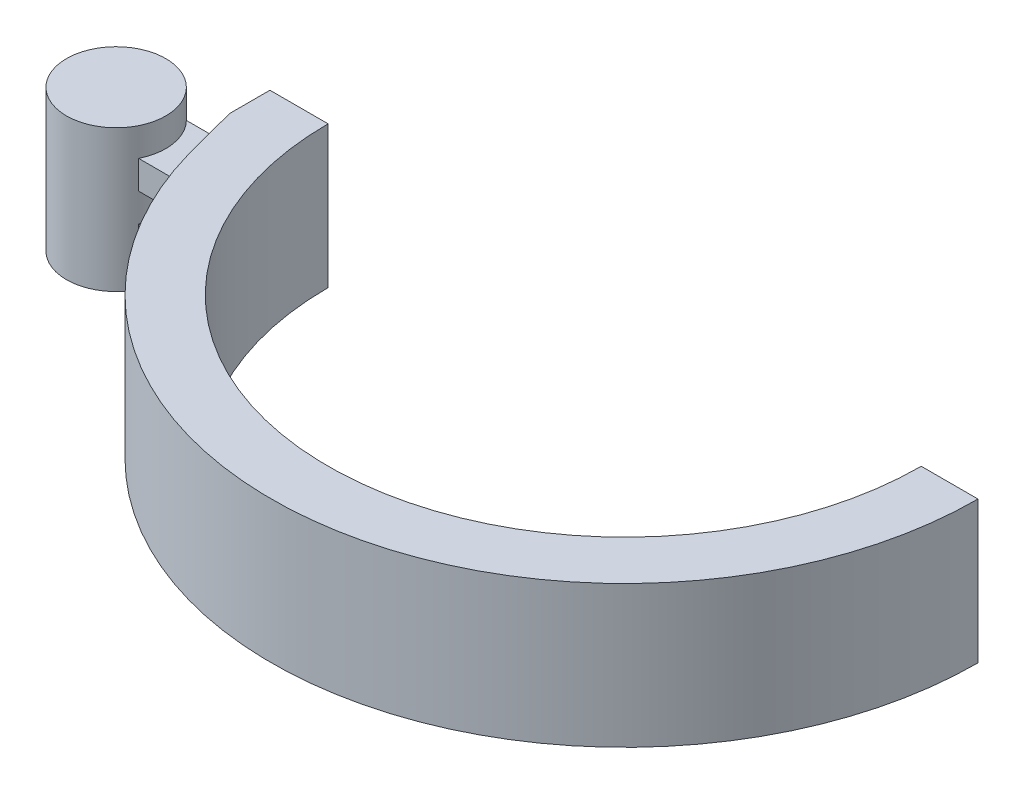
ISO-10303-21;
HEADER;
FILE_DESCRIPTION(('STEP AP214'),'2;1');
FILE_NAME('part.step','',(''),(''),'','','');
FILE_SCHEMA(('AUTOMOTIVE_DESIGN { 1 0 10303 214 1 1 1 1 }'));
ENDSEC;
DATA;
#1=APPLICATION_CONTEXT('core data for automotive mechanical design processes');
#2=APPLICATION_PROTOCOL_DEFINITION('international standard','automotive_design',2000,#1);
#3=PRODUCT_CONTEXT('',#1,'mechanical');
#4=PRODUCT('Part','Part','',(#3));
#5=PRODUCT_RELATED_PRODUCT_CATEGORY('part','',(#4));
#6=PRODUCT_DEFINITION_FORMATION('','',#4);
#7=PRODUCT_DEFINITION_CONTEXT('part definition',#1,'design');
#8=PRODUCT_DEFINITION('design','',#6,#7);
#9=PRODUCT_DEFINITION_SHAPE('','',#8);
#10=(LENGTH_UNIT() NAMED_UNIT(*) SI_UNIT(.MILLI.,.METRE.));
#11=(NAMED_UNIT(*) PLANE_ANGLE_UNIT() SI_UNIT($,.RADIAN.));
#12=(NAMED_UNIT(*) SI_UNIT($,.STERADIAN.) SOLID_ANGLE_UNIT());
#13=UNCERTAINTY_MEASURE_WITH_UNIT(LENGTH_MEASURE(1.E-05),#10,'distance_accuracy_value','');
#14=(GEOMETRIC_REPRESENTATION_CONTEXT(3) GLOBAL_UNCERTAINTY_ASSIGNED_CONTEXT((#13)) GLOBAL_UNIT_ASSIGNED_CONTEXT((#10,
#11,#12)) REPRESENTATION_CONTEXT('',''));
#15=CARTESIAN_POINT('',(0.,0.,0.));
#16=DIRECTION('',(0.,0.,1.));
#17=DIRECTION('',(1.,0.,0.));
#18=AXIS2_PLACEMENT_3D('',#15,#16,#17);
#19=CARTESIAN_POINT('',(0.,0.,0.));
#20=DIRECTION('',(0.,1.,0.));
#21=DIRECTION('',(0.,0.,1.));
#22=AXIS2_PLACEMENT_3D('',#19,#20,#21);
#23=PLANE('',#22);
#24=CARTESIAN_POINT('',(15.3000000000166,0.,-2.61808950739844));
#25=DIRECTION('',(0.,1.,0.));
#26=DIRECTION('',(0.,0.,1.));
#27=AXIS2_PLACEMENT_3D('',#24,#25,#26);
#28=CIRCLE('',#27,12.45);
#29=CARTESIAN_POINT('',(3.3213643439342,0.,0.77525512862535));
#30=VERTEX_POINT('',#29);
#31=CARTESIAN_POINT('',(27.7500000000166,0.,-2.61808950739844));
#32=VERTEX_POINT('',#31);
#33=EDGE_CURVE('E173',#30,#32,#28,.T.);
#34=ORIENTED_EDGE('',*,*,#33,.F.);
#35=CARTESIAN_POINT('',(50.5741495389799,0.,-12.610658741899));
#36=DIRECTION('',(0.,-1.,0.));
#37=DIRECTION('',(0.,0.,1.));
#38=AXIS2_PLACEMENT_3D('',#35,#36,#37);
#39=CIRCLE('',#38,49.1122021379436);
#40=CARTESIAN_POINT('',(2.8000000000166,0.,-1.22474487137465));
#41=VERTEX_POINT('',#40);
#42=EDGE_CURVE('E154',#30,#41,#39,.T.);
#43=ORIENTED_EDGE('',*,*,#42,.T.);
#44=DIRECTION('',(0.,0.,1.));
#45=VECTOR('',#44,1.);
#46=CARTESIAN_POINT('',(2.8000000000166,0.,0.));
#47=LINE('',#46,#45);
#48=CARTESIAN_POINT('',(2.8000000000166,0.,-2.61808950739844));
#49=VERTEX_POINT('',#48);
#50=EDGE_CURVE('E169',#49,#41,#47,.T.);
#51=ORIENTED_EDGE('',*,*,#50,.F.);
#52=DIRECTION('',(1.,0.,0.));
#53=VECTOR('',#52,1.);
#54=CARTESIAN_POINT('',(0.,0.,-2.61808950739844));
#55=LINE('',#54,#53);
#56=CARTESIAN_POINT('',(4.8500000000166,0.,-2.61808950739844));
#57=VERTEX_POINT('',#56);
#58=EDGE_CURVE('E182',#49,#57,#55,.T.);
#59=ORIENTED_EDGE('',*,*,#58,.T.);
#60=CARTESIAN_POINT('',(15.3000000000166,0.,-2.61808950739844));
#61=DIRECTION('',(0.,1.,0.));
#62=DIRECTION('',(0.,0.,1.));
#63=AXIS2_PLACEMENT_3D('',#60,#61,#62);
#64=CIRCLE('',#63,10.45);
#65=CARTESIAN_POINT('',(25.7500000000166,0.,-2.61808950739844));
#66=VERTEX_POINT('',#65);
#67=EDGE_CURVE('E189',#57,#66,#64,.T.);
#68=ORIENTED_EDGE('',*,*,#67,.T.);
#69=DIRECTION('',(1.,0.,0.));
#70=VECTOR('',#69,1.);
#71=CARTESIAN_POINT('',(0.,0.,-2.61808950739848));
#72=LINE('',#71,#70);
#73=EDGE_CURVE('E319',#66,#32,#72,.T.);
#74=ORIENTED_EDGE('',*,*,#73,.T.);
#75=EDGE_LOOP('',(#34,#43,#51,#59,#68,#74));
#76=FACE_BOUND('',#75,.T.);
#77=ADVANCED_FACE('F48',(#76),#23,.F.);
#78=CARTESIAN_POINT('',(0.,5.,0.77525512862535));
#79=DIRECTION('',(0.,0.,-1.));
#80=DIRECTION('',(-1.,0.,0.));
#81=AXIS2_PLACEMENT_3D('',#78,#79,#80);
#82=PLANE('',#81);
#83=DIRECTION('',(0.,-1.,0.));
#84=VECTOR('',#83,1.);
#85=CARTESIAN_POINT('',(1.56891028600749,5.,0.77525512862535));
#86=LINE('',#85,#84);
#87=CARTESIAN_POINT('',(1.56891028600749,2.,0.77525512862535));
#88=VERTEX_POINT('',#87);
#89=CARTESIAN_POINT('',(1.56891028600749,1.,0.77525512862535));
#90=VERTEX_POINT('',#89);
#91=EDGE_CURVE('E57',#88,#90,#86,.T.);
#92=ORIENTED_EDGE('',*,*,#91,.T.);
#93=DIRECTION('',(1.,0.,0.));
#94=VECTOR('',#93,1.);
#95=CARTESIAN_POINT('',(3.3213643439342,1.,0.77525512862535));
#96=LINE('',#95,#94);
#97=CARTESIAN_POINT('',(3.3213643439342,1.,0.77525512862535));
#98=VERTEX_POINT('',#97);
#99=EDGE_CURVE('E175',#90,#98,#96,.T.);
#100=ORIENTED_EDGE('',*,*,#99,.T.);
#101=DIRECTION('',(0.,-1.,0.));
#102=VECTOR('',#101,1.);
#103=CARTESIAN_POINT('',(3.3213643439342,5.,0.77525512862535));
#104=LINE('',#103,#102);
#105=CARTESIAN_POINT('',(3.3213643439342,2.,0.77525512862535));
#106=VERTEX_POINT('',#105);
#107=EDGE_CURVE('E213',#106,#98,#104,.T.);
#108=ORIENTED_EDGE('',*,*,#107,.F.);
#109=DIRECTION('',(1.,0.,0.));
#110=VECTOR('',#109,1.);
#111=CARTESIAN_POINT('',(1.56891028600749,2.,0.77525512862535));
#112=LINE('',#111,#110);
#113=EDGE_CURVE('E64',#88,#106,#112,.T.);
#114=ORIENTED_EDGE('',*,*,#113,.F.);
#115=EDGE_LOOP('',(#92,#100,#108,#114));
#116=FACE_BOUND('',#115,.T.);
#117=ADVANCED_FACE('F232',(#116),#82,.F.);
#118=CARTESIAN_POINT('',(0.,5.,-1.22474487137465));
#119=DIRECTION('',(0.,0.,-1.));
#120=DIRECTION('',(-1.,0.,0.));
#121=AXIS2_PLACEMENT_3D('',#118,#119,#120);
#122=PLANE('',#121);
#123=DIRECTION('',(-1.,0.,0.));
#124=VECTOR('',#123,1.);
#125=CARTESIAN_POINT('',(2.8000000000166,1.,-1.22474487137465));
#126=LINE('',#125,#124);
#127=CARTESIAN_POINT('',(2.8000000000166,1.,-1.22474487137465));
#128=VERTEX_POINT('',#127);
#129=CARTESIAN_POINT('',(1.2500000000166,1.,-1.22474487137465));
#130=VERTEX_POINT('',#129);
#131=EDGE_CURVE('E240',#128,#130,#126,.T.);
#132=ORIENTED_EDGE('',*,*,#131,.T.);
#133=DIRECTION('',(0.,-1.,0.));
#134=VECTOR('',#133,1.);
#135=CARTESIAN_POINT('',(1.2500000000166,5.,-1.22474487137465));
#136=LINE('',#135,#134);
#137=CARTESIAN_POINT('',(1.2500000000166,2.,-1.22474487137465));
#138=VERTEX_POINT('',#137);
#139=EDGE_CURVE('E198',#138,#130,#136,.T.);
#140=ORIENTED_EDGE('',*,*,#139,.F.);
#141=DIRECTION('',(-1.,0.,0.));
#142=VECTOR('',#141,1.);
#143=CARTESIAN_POINT('',(2.8000000000166,2.,-1.22474487137465));
#144=LINE('',#143,#142);
#145=CARTESIAN_POINT('',(2.8000000000166,2.,-1.22474487137465));
#146=VERTEX_POINT('',#145);
#147=EDGE_CURVE('E249',#146,#138,#144,.T.);
#148=ORIENTED_EDGE('',*,*,#147,.F.);
#149=DIRECTION('',(0.,-1.,0.));
#150=VECTOR('',#149,1.);
#151=CARTESIAN_POINT('',(2.8000000000166,5.,-1.22474487137465));
#152=LINE('',#151,#150);
#153=EDGE_CURVE('E197',#146,#128,#152,.T.);
#154=ORIENTED_EDGE('',*,*,#153,.T.);
#155=EDGE_LOOP('',(#132,#140,#148,#154));
#156=FACE_BOUND('',#155,.T.);
#157=ADVANCED_FACE('F360',(#156),#122,.T.);
#158=CARTESIAN_POINT('',(1.56891028600749,4.,0.77525512862535));
#159=VERTEX_POINT('',#158);
#160=CARTESIAN_POINT('',(1.56891028600749,3.,0.77525512862535));
#161=VERTEX_POINT('',#160);
#162=EDGE_CURVE('E11',#159,#161,#86,.T.);
#163=ORIENTED_EDGE('',*,*,#162,.T.);
#164=DIRECTION('',(1.,0.,0.));
#165=VECTOR('',#164,1.);
#166=CARTESIAN_POINT('',(1.56891028600749,3.,0.77525512862535));
#167=LINE('',#166,#165);
#168=CARTESIAN_POINT('',(3.3213643439342,3.,0.77525512862535));
#169=VERTEX_POINT('',#168);
#170=EDGE_CURVE('E250',#161,#169,#167,.T.);
#171=ORIENTED_EDGE('',*,*,#170,.T.);
#172=CARTESIAN_POINT('',(3.3213643439342,4.,0.77525512862535));
#173=VERTEX_POINT('',#172);
#174=EDGE_CURVE('E217',#173,#169,#104,.T.);
#175=ORIENTED_EDGE('',*,*,#174,.F.);
#176=DIRECTION('',(1.,0.,0.));
#177=VECTOR('',#176,1.);
#178=CARTESIAN_POINT('',(3.3213643439342,4.,0.77525512862535));
#179=LINE('',#178,#177);
#180=EDGE_CURVE('E289',#159,#173,#179,.T.);
#181=ORIENTED_EDGE('',*,*,#180,.F.);
#182=EDGE_LOOP('',(#163,#171,#175,#181));
#183=FACE_BOUND('',#182,.T.);
#184=ADVANCED_FACE('F346',(#183),#82,.F.);
#185=DIRECTION('',(-1.,0.,0.));
#186=VECTOR('',#185,1.);
#187=CARTESIAN_POINT('',(2.8000000000166,3.,-1.22474487137465));
#188=LINE('',#187,#186);
#189=CARTESIAN_POINT('',(2.8000000000166,3.,-1.22474487137465));
#190=VERTEX_POINT('',#189);
#191=CARTESIAN_POINT('',(1.2500000000166,3.,-1.22474487137465));
#192=VERTEX_POINT('',#191);
#193=EDGE_CURVE('E262',#190,#192,#188,.T.);
#194=ORIENTED_EDGE('',*,*,#193,.T.);
#195=CARTESIAN_POINT('',(1.2500000000166,4.,-1.22474487137465));
#196=VERTEX_POINT('',#195);
#197=EDGE_CURVE('E193',#196,#192,#136,.T.);
#198=ORIENTED_EDGE('',*,*,#197,.F.);
#199=DIRECTION('',(-1.,0.,0.));
#200=VECTOR('',#199,1.);
#201=CARTESIAN_POINT('',(2.8000000000166,4.,-1.22474487137465));
#202=LINE('',#201,#200);
#203=CARTESIAN_POINT('',(2.8000000000166,4.,-1.22474487137465));
#204=VERTEX_POINT('',#203);
#205=EDGE_CURVE('E282',#204,#196,#202,.T.);
#206=ORIENTED_EDGE('',*,*,#205,.F.);
#207=EDGE_CURVE('E202',#204,#190,#152,.T.);
#208=ORIENTED_EDGE('',*,*,#207,.T.);
#209=EDGE_LOOP('',(#194,#198,#206,#208));
#210=FACE_BOUND('',#209,.T.);
#211=ADVANCED_FACE('F354',(#210),#122,.T.);
#212=CARTESIAN_POINT('',(0.,5.,0.));
#213=DIRECTION('',(0.,1.,0.));
#214=DIRECTION('',(0.,0.,1.));
#215=AXIS2_PLACEMENT_3D('',#212,#213,#214);
#216=PLANE('',#215);
#217=CARTESIAN_POINT('',(50.574149538442,5.,-12.6106587417588));
#218=DIRECTION('',(0.,-1.,0.));
#219=DIRECTION('',(0.,0.,1.));
#220=AXIS2_PLACEMENT_3D('',#217,#218,#219);
#221=CIRCLE('',#220,49.1122021373878);
#222=CARTESIAN_POINT('',(3.3213643439342,5.,0.77525512862535));
#223=VERTEX_POINT('',#222);
#224=CARTESIAN_POINT('',(2.8000000000166,5.,-1.22474487137465));
#225=VERTEX_POINT('',#224);
#226=EDGE_CURVE('E274',#223,#225,#221,.T.);
#227=ORIENTED_EDGE('',*,*,#226,.F.);
#228=CARTESIAN_POINT('',(15.3000000000166,5.,-2.61808950739844));
#229=DIRECTION('',(0.,1.,0.));
#230=DIRECTION('',(0.,0.,1.));
#231=AXIS2_PLACEMENT_3D('',#228,#229,#230);
#232=CIRCLE('',#231,12.45);
#233=CARTESIAN_POINT('',(27.7500000000166,5.,-2.61808950739844));
#234=VERTEX_POINT('',#233);
#235=EDGE_CURVE('E187',#223,#234,#232,.T.);
#236=ORIENTED_EDGE('',*,*,#235,.T.);
#237=DIRECTION('',(1.,0.,0.));
#238=VECTOR('',#237,1.);
#239=CARTESIAN_POINT('',(0.,5.,-2.61808950739848));
#240=LINE('',#239,#238);
#241=CARTESIAN_POINT('',(25.7500000000166,5.,-2.61808950739844));
#242=VERTEX_POINT('',#241);
#243=EDGE_CURVE('E298',#242,#234,#240,.T.);
#244=ORIENTED_EDGE('',*,*,#243,.F.);
#245=CARTESIAN_POINT('',(15.3000000000166,5.,-2.61808950739844));
#246=DIRECTION('',(0.,1.,0.));
#247=DIRECTION('',(0.,0.,1.));
#248=AXIS2_PLACEMENT_3D('',#245,#246,#247);
#249=CIRCLE('',#248,10.45);
#250=CARTESIAN_POINT('',(4.8500000000166,5.,-2.61808950739844));
#251=VERTEX_POINT('',#250);
#252=EDGE_CURVE('E302',#251,#242,#249,.T.);
#253=ORIENTED_EDGE('',*,*,#252,.F.);
#254=DIRECTION('',(1.,0.,0.));
#255=VECTOR('',#254,1.);
#256=CARTESIAN_POINT('',(0.,5.,-2.61808950739844));
#257=LINE('',#256,#255);
#258=CARTESIAN_POINT('',(2.8000000000166,5.,-2.61808950739844));
#259=VERTEX_POINT('',#258);
#260=EDGE_CURVE('E306',#259,#251,#257,.T.);
#261=ORIENTED_EDGE('',*,*,#260,.F.);
#262=DIRECTION('',(0.,0.,1.));
#263=VECTOR('',#262,1.);
#264=CARTESIAN_POINT('',(2.8000000000166,5.,0.));
#265=LINE('',#264,#263);
#266=EDGE_CURVE('E310',#259,#225,#265,.T.);
#267=ORIENTED_EDGE('',*,*,#266,.T.);
#268=EDGE_LOOP('',(#227,#236,#244,#253,#261,#267));
#269=FACE_BOUND('',#268,.T.);
#270=ADVANCED_FACE('F334',(#269),#216,.T.);
#271=CARTESIAN_POINT('',(0.,5.,0.));
#272=DIRECTION('',(0.,-1.,0.));
#273=DIRECTION('',(0.,0.,-1.));
#274=AXIS2_PLACEMENT_3D('',#271,#272,#273);
#275=CYLINDRICAL_SURFACE('',#274,1.75);
#276=CARTESIAN_POINT('',(0.,1.,0.));
#277=DIRECTION('',(0.,-1.,0.));
#278=DIRECTION('',(0.,0.,-1.));
#279=AXIS2_PLACEMENT_3D('',#276,#277,#278);
#280=CIRCLE('',#279,1.75);
#281=EDGE_CURVE('E237',#130,#90,#280,.T.);
#282=ORIENTED_EDGE('',*,*,#281,.T.);
#283=ORIENTED_EDGE('',*,*,#91,.F.);
#284=CARTESIAN_POINT('',(0.,2.,0.));
#285=DIRECTION('',(0.,-1.,0.));
#286=DIRECTION('',(0.,0.,-1.));
#287=AXIS2_PLACEMENT_3D('',#284,#285,#286);
#288=CIRCLE('',#287,1.75);
#289=EDGE_CURVE('E254',#138,#88,#288,.T.);
#290=ORIENTED_EDGE('',*,*,#289,.F.);
#291=ORIENTED_EDGE('',*,*,#139,.T.);
#292=EDGE_LOOP('',(#282,#283,#290,#291));
#293=FACE_BOUND('',#292,.T.);
#294=CARTESIAN_POINT('',(0.,3.,0.));
#295=DIRECTION('',(0.,-1.,0.));
#296=DIRECTION('',(0.,0.,-1.));
#297=AXIS2_PLACEMENT_3D('',#294,#295,#296);
#298=CIRCLE('',#297,1.75);
#299=EDGE_CURVE('E266',#192,#161,#298,.T.);
#300=ORIENTED_EDGE('',*,*,#299,.T.);
#301=ORIENTED_EDGE('',*,*,#162,.F.);
#302=CARTESIAN_POINT('',(0.,4.,0.));
#303=DIRECTION('',(0.,-1.,0.));
#304=DIRECTION('',(0.,0.,1.));
#305=AXIS2_PLACEMENT_3D('',#302,#303,#304);
#306=CIRCLE('',#305,1.75);
#307=EDGE_CURVE('E286',#196,#159,#306,.T.);
#308=ORIENTED_EDGE('',*,*,#307,.F.);
#309=ORIENTED_EDGE('',*,*,#197,.T.);
#310=EDGE_LOOP('',(#300,#301,#308,#309));
#311=FACE_BOUND('',#310,.T.);
#312=CARTESIAN_POINT('',(0.,0.,0.));
#313=DIRECTION('',(0.,1.,0.));
#314=DIRECTION('',(0.,0.,1.));
#315=AXIS2_PLACEMENT_3D('',#312,#313,#314);
#316=CIRCLE('',#315,1.75);
#317=CARTESIAN_POINT('',(0.,0.,1.75));
#318=VERTEX_POINT('',#317);
#319=EDGE_CURVE('E293',#318,#318,#316,.T.);
#320=ORIENTED_EDGE('',*,*,#319,.T.);
#321=EDGE_LOOP('',(#320));
#322=FACE_BOUND('',#321,.T.);
#323=CARTESIAN_POINT('',(0.,5.,0.));
#324=DIRECTION('',(0.,1.,0.));
#325=DIRECTION('',(0.,0.,1.));
#326=AXIS2_PLACEMENT_3D('',#323,#324,#325);
#327=CIRCLE('',#326,1.75);
#328=CARTESIAN_POINT('',(0.,5.,1.75));
#329=VERTEX_POINT('',#328);
#330=EDGE_CURVE('E181',#329,#329,#327,.T.);
#331=ORIENTED_EDGE('',*,*,#330,.F.);
#332=EDGE_LOOP('',(#331));
#333=FACE_BOUND('',#332,.T.);
#334=ADVANCED_FACE('F50',(#293,#311,#322,#333),#275,.T.);
#335=CARTESIAN_POINT('',(15.3000000000166,5.,-2.61808950739844));
#336=DIRECTION('',(0.,-1.,0.));
#337=DIRECTION('',(0.,0.,-1.));
#338=AXIS2_PLACEMENT_3D('',#335,#336,#337);
#339=CYLINDRICAL_SURFACE('',#338,12.45);
#340=ORIENTED_EDGE('',*,*,#33,.T.);
#341=DIRECTION('',(0.,-1.,0.));
#342=VECTOR('',#341,1.);
#343=CARTESIAN_POINT('',(27.7500000000166,5.,-2.61808950739844));
#344=LINE('',#343,#342);
#345=EDGE_CURVE('E211',#234,#32,#344,.T.);
#346=ORIENTED_EDGE('',*,*,#345,.F.);
#347=ORIENTED_EDGE('',*,*,#235,.F.);
#348=EDGE_CURVE('E214',#223,#173,#104,.T.);
#349=ORIENTED_EDGE('',*,*,#348,.T.);
#350=ORIENTED_EDGE('',*,*,#174,.T.);
#351=DIRECTION('',(0.,1.,0.));
#352=VECTOR('',#351,1.);
#353=CARTESIAN_POINT('',(3.3213643439342,2.,0.77525512862535));
#354=LINE('',#353,#352);
#355=EDGE_CURVE('E229',#106,#169,#354,.T.);
#356=ORIENTED_EDGE('',*,*,#355,.F.);
#357=ORIENTED_EDGE('',*,*,#107,.T.);
#358=DIRECTION('',(0.,1.,0.));
#359=VECTOR('',#358,1.);
#360=CARTESIAN_POINT('',(3.3213643439342,0.,0.77525512862535));
#361=LINE('',#360,#359);
#362=EDGE_CURVE('E163',#30,#98,#361,.T.);
#363=ORIENTED_EDGE('',*,*,#362,.F.);
#364=EDGE_LOOP('',(#340,#346,#347,#349,#350,#356,#357,#363));
#365=FACE_BOUND('',#364,.T.);
#366=ADVANCED_FACE('F228',(#365),#339,.T.);
#367=CARTESIAN_POINT('',(0.,5.,-2.61808950739848));
#368=DIRECTION('',(0.,0.,-1.));
#369=DIRECTION('',(-1.,0.,0.));
#370=AXIS2_PLACEMENT_3D('',#367,#368,#369);
#371=PLANE('',#370);
#372=ORIENTED_EDGE('',*,*,#73,.F.);
#373=DIRECTION('',(0.,-1.,0.));
#374=VECTOR('',#373,1.);
#375=CARTESIAN_POINT('',(25.7500000000166,5.,-2.61808950739844));
#376=LINE('',#375,#374);
#377=EDGE_CURVE('E208',#242,#66,#376,.T.);
#378=ORIENTED_EDGE('',*,*,#377,.F.);
#379=ORIENTED_EDGE('',*,*,#243,.T.);
#380=ORIENTED_EDGE('',*,*,#345,.T.);
#381=EDGE_LOOP('',(#372,#378,#379,#380));
#382=FACE_BOUND('',#381,.T.);
#383=ADVANCED_FACE('F330',(#382),#371,.T.);
#384=CARTESIAN_POINT('',(15.3000000000166,5.,-2.61808950739844));
#385=DIRECTION('',(0.,-1.,0.));
#386=DIRECTION('',(0.,0.,-1.));
#387=AXIS2_PLACEMENT_3D('',#384,#385,#386);
#388=CYLINDRICAL_SURFACE('',#387,10.45);
#389=ORIENTED_EDGE('',*,*,#67,.F.);
#390=DIRECTION('',(0.,-1.,0.));
#391=VECTOR('',#390,1.);
#392=CARTESIAN_POINT('',(4.8500000000166,5.,-2.61808950739844));
#393=LINE('',#392,#391);
#394=EDGE_CURVE('E205',#251,#57,#393,.T.);
#395=ORIENTED_EDGE('',*,*,#394,.F.);
#396=ORIENTED_EDGE('',*,*,#252,.T.);
#397=ORIENTED_EDGE('',*,*,#377,.T.);
#398=EDGE_LOOP('',(#389,#395,#396,#397));
#399=FACE_BOUND('',#398,.T.);
#400=ADVANCED_FACE('F326',(#399),#388,.F.);
#401=CARTESIAN_POINT('',(0.,5.,-2.61808950739844));
#402=DIRECTION('',(0.,0.,-1.));
#403=DIRECTION('',(-1.,0.,0.));
#404=AXIS2_PLACEMENT_3D('',#401,#402,#403);
#405=PLANE('',#404);
#406=ORIENTED_EDGE('',*,*,#58,.F.);
#407=DIRECTION('',(0.,-1.,0.));
#408=VECTOR('',#407,1.);
#409=CARTESIAN_POINT('',(2.8000000000166,5.,-2.61808950739844));
#410=LINE('',#409,#408);
#411=EDGE_CURVE('E179',#259,#49,#410,.T.);
#412=ORIENTED_EDGE('',*,*,#411,.F.);
#413=ORIENTED_EDGE('',*,*,#260,.T.);
#414=ORIENTED_EDGE('',*,*,#394,.T.);
#415=EDGE_LOOP('',(#406,#412,#413,#414));
#416=FACE_BOUND('',#415,.T.);
#417=ADVANCED_FACE('F552',(#416),#405,.T.);
#418=CARTESIAN_POINT('',(2.8000000000166,5.,0.));
#419=DIRECTION('',(1.,0.,0.));
#420=DIRECTION('',(0.,0.,-1.));
#421=AXIS2_PLACEMENT_3D('',#418,#419,#420);
#422=PLANE('',#421);
#423=ORIENTED_EDGE('',*,*,#50,.T.);
#424=DIRECTION('',(0.,1.,0.));
#425=VECTOR('',#424,1.);
#426=CARTESIAN_POINT('',(2.8000000000166,0.,-1.22474487137465));
#427=LINE('',#426,#425);
#428=EDGE_CURVE('E151',#41,#128,#427,.T.);
#429=ORIENTED_EDGE('',*,*,#428,.T.);
#430=ORIENTED_EDGE('',*,*,#153,.F.);
#431=DIRECTION('',(0.,1.,0.));
#432=VECTOR('',#431,1.);
#433=CARTESIAN_POINT('',(2.8000000000166,2.,-1.22474487137465));
#434=LINE('',#433,#432);
#435=EDGE_CURVE('E259',#146,#190,#434,.T.);
#436=ORIENTED_EDGE('',*,*,#435,.T.);
#437=ORIENTED_EDGE('',*,*,#207,.F.);
#438=EDGE_CURVE('E199',#225,#204,#152,.T.);
#439=ORIENTED_EDGE('',*,*,#438,.F.);
#440=ORIENTED_EDGE('',*,*,#266,.F.);
#441=ORIENTED_EDGE('',*,*,#411,.T.);
#442=EDGE_LOOP('',(#423,#429,#430,#436,#437,#439,#440,#441));
#443=FACE_BOUND('',#442,.T.);
#444=ADVANCED_FACE('F177',(#443),#422,.F.);
#445=ORIENTED_EDGE('',*,*,#330,.T.);
#446=EDGE_LOOP('',(#445));
#447=FACE_BOUND('',#446,.T.);
#448=ADVANCED_FACE('F383',(#447),#216,.T.);
#449=ORIENTED_EDGE('',*,*,#319,.F.);
#450=EDGE_LOOP('',(#449));
#451=FACE_BOUND('',#450,.T.);
#452=ADVANCED_FACE('F376',(#451),#23,.F.);
#453=CARTESIAN_POINT('',(50.574149538442,4.,-12.6106587417588));
#454=DIRECTION('',(0.,1.,0.));
#455=DIRECTION('',(0.,0.,1.));
#456=AXIS2_PLACEMENT_3D('',#453,#454,#455);
#457=CYLINDRICAL_SURFACE('',#456,49.1122021373878);
#458=ORIENTED_EDGE('',*,*,#226,.T.);
#459=ORIENTED_EDGE('',*,*,#438,.T.);
#460=CARTESIAN_POINT('',(50.574149538442,4.,-12.6106587417588));
#461=DIRECTION('',(0.,-1.,0.));
#462=DIRECTION('',(0.,0.,1.));
#463=AXIS2_PLACEMENT_3D('',#460,#461,#462);
#464=CIRCLE('',#463,49.1122021373878);
#465=EDGE_CURVE('E278',#173,#204,#464,.T.);
#466=ORIENTED_EDGE('',*,*,#465,.F.);
#467=ORIENTED_EDGE('',*,*,#348,.F.);
#468=EDGE_LOOP('',(#458,#459,#466,#467));
#469=FACE_BOUND('',#468,.T.);
#470=ADVANCED_FACE('F338',(#469),#457,.T.);
#471=CARTESIAN_POINT('',(50.574149538442,4.,-12.6106587417588));
#472=DIRECTION('',(0.,1.,0.));
#473=DIRECTION('',(0.,0.,1.));
#474=AXIS2_PLACEMENT_3D('',#471,#472,#473);
#475=PLANE('',#474);
#476=ORIENTED_EDGE('',*,*,#465,.T.);
#477=ORIENTED_EDGE('',*,*,#205,.T.);
#478=ORIENTED_EDGE('',*,*,#307,.T.);
#479=ORIENTED_EDGE('',*,*,#180,.T.);
#480=EDGE_LOOP('',(#476,#477,#478,#479));
#481=FACE_BOUND('',#480,.T.);
#482=ADVANCED_FACE('F343',(#481),#475,.T.);
#483=CARTESIAN_POINT('',(50.574149538442,2.,-12.6106587417588));
#484=DIRECTION('',(0.,1.,0.));
#485=DIRECTION('',(0.,0.,1.));
#486=AXIS2_PLACEMENT_3D('',#483,#484,#485);
#487=CYLINDRICAL_SURFACE('',#486,49.1122021373878);
#488=CARTESIAN_POINT('',(50.574149538442,3.,-12.6106587417588));
#489=DIRECTION('',(0.,-1.,0.));
#490=DIRECTION('',(0.,0.,1.));
#491=AXIS2_PLACEMENT_3D('',#488,#489,#490);
#492=CIRCLE('',#491,49.1122021373878);
#493=EDGE_CURVE('E72',#169,#190,#492,.T.);
#494=ORIENTED_EDGE('',*,*,#493,.T.);
#495=ORIENTED_EDGE('',*,*,#435,.F.);
#496=CARTESIAN_POINT('',(50.574149538442,2.,-12.6106587417588));
#497=DIRECTION('',(0.,-1.,0.));
#498=DIRECTION('',(0.,0.,1.));
#499=AXIS2_PLACEMENT_3D('',#496,#497,#498);
#500=CIRCLE('',#499,49.1122021373878);
#501=EDGE_CURVE('E246',#106,#146,#500,.T.);
#502=ORIENTED_EDGE('',*,*,#501,.F.);
#503=ORIENTED_EDGE('',*,*,#355,.T.);
#504=EDGE_LOOP('',(#494,#495,#502,#503));
#505=FACE_BOUND('',#504,.T.);
#506=ADVANCED_FACE('F364',(#505),#487,.T.);
#507=CARTESIAN_POINT('',(50.574149538442,2.,-12.6106587417588));
#508=DIRECTION('',(0.,1.,0.));
#509=DIRECTION('',(0.,0.,1.));
#510=AXIS2_PLACEMENT_3D('',#507,#508,#509);
#511=PLANE('',#510);
#512=ORIENTED_EDGE('',*,*,#501,.T.);
#513=ORIENTED_EDGE('',*,*,#147,.T.);
#514=ORIENTED_EDGE('',*,*,#289,.T.);
#515=ORIENTED_EDGE('',*,*,#113,.T.);
#516=EDGE_LOOP('',(#512,#513,#514,#515));
#517=FACE_BOUND('',#516,.T.);
#518=ADVANCED_FACE('F363',(#517),#511,.T.);
#519=CARTESIAN_POINT('',(50.574149538442,3.,-12.6106587417588));
#520=DIRECTION('',(0.,1.,0.));
#521=DIRECTION('',(0.,0.,1.));
#522=AXIS2_PLACEMENT_3D('',#519,#520,#521);
#523=PLANE('',#522);
#524=ORIENTED_EDGE('',*,*,#493,.F.);
#525=ORIENTED_EDGE('',*,*,#170,.F.);
#526=ORIENTED_EDGE('',*,*,#299,.F.);
#527=ORIENTED_EDGE('',*,*,#193,.F.);
#528=EDGE_LOOP('',(#524,#525,#526,#527));
#529=FACE_BOUND('',#528,.T.);
#530=ADVANCED_FACE('F349',(#529),#523,.F.);
#531=CARTESIAN_POINT('',(50.5741495389799,0.,-12.610658741899));
#532=DIRECTION('',(0.,1.,0.));
#533=DIRECTION('',(0.,0.,1.));
#534=AXIS2_PLACEMENT_3D('',#531,#532,#533);
#535=CYLINDRICAL_SURFACE('',#534,49.1122021379436);
#536=CARTESIAN_POINT('',(50.5741495389799,1.,-12.610658741899));
#537=DIRECTION('',(0.,-1.,0.));
#538=DIRECTION('',(0.,0.,1.));
#539=AXIS2_PLACEMENT_3D('',#536,#537,#538);
#540=CIRCLE('',#539,49.1122021379436);
#541=EDGE_CURVE('E157',#98,#128,#540,.T.);
#542=ORIENTED_EDGE('',*,*,#541,.T.);
#543=ORIENTED_EDGE('',*,*,#428,.F.);
#544=ORIENTED_EDGE('',*,*,#42,.F.);
#545=ORIENTED_EDGE('',*,*,#362,.T.);
#546=EDGE_LOOP('',(#542,#543,#544,#545));
#547=FACE_BOUND('',#546,.T.);
#548=ADVANCED_FACE('F153',(#547),#535,.T.);
#549=CARTESIAN_POINT('',(50.5741495389799,1.,-12.610658741899));
#550=DIRECTION('',(0.,1.,0.));
#551=DIRECTION('',(0.,0.,1.));
#552=AXIS2_PLACEMENT_3D('',#549,#550,#551);
#553=PLANE('',#552);
#554=ORIENTED_EDGE('',*,*,#541,.F.);
#555=ORIENTED_EDGE('',*,*,#99,.F.);
#556=ORIENTED_EDGE('',*,*,#281,.F.);
#557=ORIENTED_EDGE('',*,*,#131,.F.);
#558=EDGE_LOOP('',(#554,#555,#556,#557));
#559=FACE_BOUND('',#558,.T.);
#560=ADVANCED_FACE('F403',(#559),#553,.F.);
#561=CLOSED_SHELL('',(#77,#117,#157,#184,#211,#270,#334,#366,#383,#400,#417,#444,#448,#452,#470,
#482,#506,#518,#530,#548,#560));
#562=MANIFOLD_SOLID_BREP('B2',#561);
#563=ADVANCED_BREP_SHAPE_REPRESENTATION('',(#18,#562),#14);
#564=SHAPE_DEFINITION_REPRESENTATION(#9,#563);
ENDSEC;
END-ISO-10303-21;
